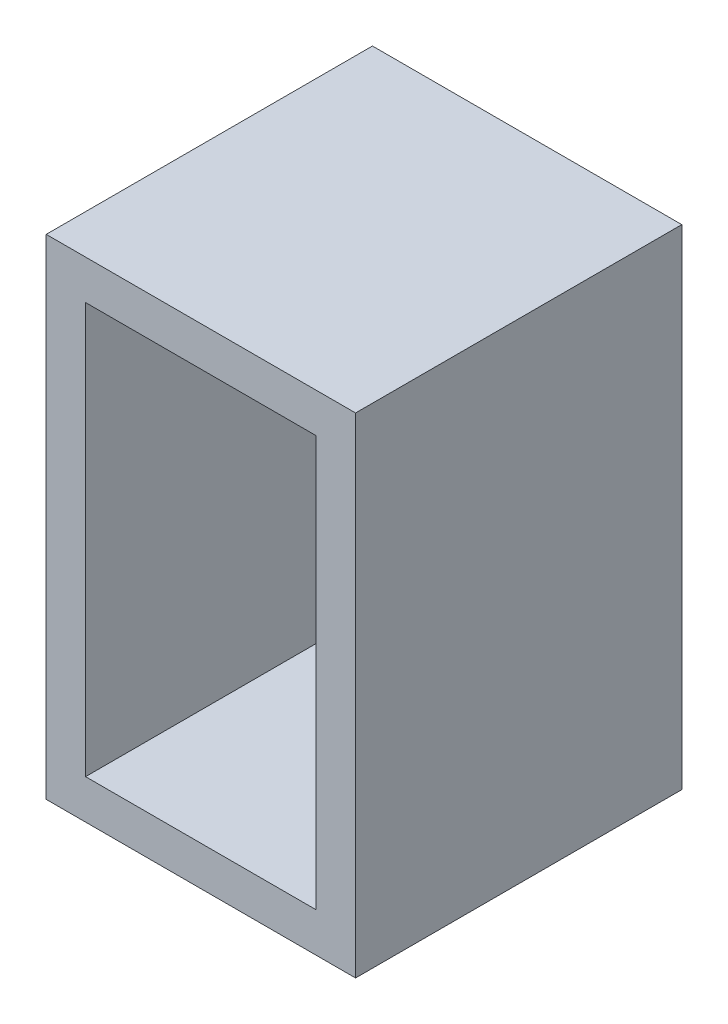
ISO-10303-21;
HEADER;
FILE_DESCRIPTION(('STEP AP214'),'2;1');
FILE_NAME('part.step','',(''),(''),'','','');
FILE_SCHEMA(('AUTOMOTIVE_DESIGN { 1 0 10303 214 1 1 1 1 }'));
ENDSEC;
DATA;
#1=APPLICATION_CONTEXT('core data for automotive mechanical design processes');
#2=APPLICATION_PROTOCOL_DEFINITION('international standard','automotive_design',2000,#1);
#3=PRODUCT_CONTEXT('',#1,'mechanical');
#4=PRODUCT('Part','Part','',(#3));
#5=PRODUCT_RELATED_PRODUCT_CATEGORY('part','',(#4));
#6=PRODUCT_DEFINITION_FORMATION('','',#4);
#7=PRODUCT_DEFINITION_CONTEXT('part definition',#1,'design');
#8=PRODUCT_DEFINITION('design','',#6,#7);
#9=PRODUCT_DEFINITION_SHAPE('','',#8);
#10=(LENGTH_UNIT() NAMED_UNIT(*) SI_UNIT(.MILLI.,.METRE.));
#11=(NAMED_UNIT(*) PLANE_ANGLE_UNIT() SI_UNIT($,.RADIAN.));
#12=(NAMED_UNIT(*) SI_UNIT($,.STERADIAN.) SOLID_ANGLE_UNIT());
#13=UNCERTAINTY_MEASURE_WITH_UNIT(LENGTH_MEASURE(1.E-05),#10,'distance_accuracy_value','');
#14=(GEOMETRIC_REPRESENTATION_CONTEXT(3) GLOBAL_UNCERTAINTY_ASSIGNED_CONTEXT((#13)) GLOBAL_UNIT_ASSIGNED_CONTEXT((#10,
#11,#12)) REPRESENTATION_CONTEXT('',''));
#15=CARTESIAN_POINT('',(0.,0.,0.));
#16=DIRECTION('',(0.,0.,1.));
#17=DIRECTION('',(1.,0.,0.));
#18=AXIS2_PLACEMENT_3D('',#15,#16,#17);
#19=CARTESIAN_POINT('',(0.,8.24999999999999,13.2544332206247));
#20=DIRECTION('',(0.,1.,0.));
#21=DIRECTION('',(0.,0.,1.));
#22=AXIS2_PLACEMENT_3D('',#19,#20,#21);
#23=PLANE('',#22);
#24=DIRECTION('',(0.,0.,1.));
#25=VECTOR('',#24,1.);
#26=CARTESIAN_POINT('',(1.25,8.24999999999999,-11.1241437954473));
#27=LINE('',#26,#25);
#28=CARTESIAN_POINT('',(1.25,8.24999999999999,-2.));
#29=VERTEX_POINT('',#28);
#30=CARTESIAN_POINT('',(1.25,8.24999999999999,0.));
#31=VERTEX_POINT('',#30);
#32=EDGE_CURVE('E178',#29,#31,#27,.T.);
#33=ORIENTED_EDGE('',*,*,#32,.F.);
#34=DIRECTION('',(1.,0.,0.));
#35=VECTOR('',#34,1.);
#36=CARTESIAN_POINT('',(0.,8.24999999999999,-2.));
#37=LINE('',#36,#35);
#38=CARTESIAN_POINT('',(-1.45,8.24999999999999,-2.));
#39=VERTEX_POINT('',#38);
#40=EDGE_CURVE('E70',#39,#29,#37,.T.);
#41=ORIENTED_EDGE('',*,*,#40,.F.);
#42=DIRECTION('',(0.,0.,-1.));
#43=VECTOR('',#42,1.);
#44=CARTESIAN_POINT('',(-1.45,8.24999999999999,13.2544332206247));
#45=LINE('',#44,#43);
#46=CARTESIAN_POINT('',(-1.45,8.24999999999999,0.));
#47=VERTEX_POINT('',#46);
#48=EDGE_CURVE('E184',#47,#39,#45,.T.);
#49=ORIENTED_EDGE('',*,*,#48,.F.);
#50=DIRECTION('',(1.,0.,0.));
#51=VECTOR('',#50,1.);
#52=CARTESIAN_POINT('',(0.,8.24999999999999,0.));
#53=LINE('',#52,#51);
#54=EDGE_CURVE('E171',#47,#31,#53,.T.);
#55=ORIENTED_EDGE('',*,*,#54,.T.);
#56=EDGE_LOOP('',(#33,#41,#49,#55));
#57=FACE_BOUND('',#56,.T.);
#58=ADVANCED_FACE('F47',(#57),#23,.T.);
#59=CARTESIAN_POINT('',(0.,0.,-2.));
#60=DIRECTION('',(0.,0.,1.));
#61=DIRECTION('',(1.,0.,0.));
#62=AXIS2_PLACEMENT_3D('',#59,#60,#61);
#63=PLANE('',#62);
#64=ORIENTED_EDGE('',*,*,#40,.T.);
#65=DIRECTION('',(0.,-1.,0.));
#66=VECTOR('',#65,1.);
#67=CARTESIAN_POINT('',(1.25,0.,-2.));
#68=LINE('',#67,#66);
#69=CARTESIAN_POINT('',(1.25,-15.25,-2.));
#70=VERTEX_POINT('',#69);
#71=EDGE_CURVE('E63',#29,#70,#68,.T.);
#72=ORIENTED_EDGE('',*,*,#71,.T.);
#73=DIRECTION('',(1.,0.,0.));
#74=VECTOR('',#73,1.);
#75=CARTESIAN_POINT('',(0.,-15.25,-2.));
#76=LINE('',#75,#74);
#77=CARTESIAN_POINT('',(10.25,-15.25,-2.));
#78=VERTEX_POINT('',#77);
#79=EDGE_CURVE('E224',#70,#78,#76,.T.);
#80=ORIENTED_EDGE('',*,*,#79,.T.);
#81=DIRECTION('',(0.,-1.,0.));
#82=VECTOR('',#81,1.);
#83=CARTESIAN_POINT('',(10.25,0.,-2.));
#84=LINE('',#83,#82);
#85=CARTESIAN_POINT('',(10.25,8.24999999999999,-2.));
#86=VERTEX_POINT('',#85);
#87=EDGE_CURVE('E176',#86,#78,#84,.T.);
#88=ORIENTED_EDGE('',*,*,#87,.F.);
#89=CARTESIAN_POINT('',(11.75,8.24999999999999,-2.));
#90=VERTEX_POINT('',#89);
#91=EDGE_CURVE('E216',#86,#90,#37,.T.);
#92=ORIENTED_EDGE('',*,*,#91,.T.);
#93=DIRECTION('',(0.,1.,0.));
#94=VECTOR('',#93,1.);
#95=CARTESIAN_POINT('',(11.75,0.,-2.));
#96=LINE('',#95,#94);
#97=CARTESIAN_POINT('',(11.75,9.44999999999999,-2.));
#98=VERTEX_POINT('',#97);
#99=EDGE_CURVE('E205',#90,#98,#96,.T.);
#100=ORIENTED_EDGE('',*,*,#99,.T.);
#101=DIRECTION('',(1.,0.,0.));
#102=VECTOR('',#101,1.);
#103=CARTESIAN_POINT('',(0.,9.44999999999999,-2.));
#104=LINE('',#103,#102);
#105=CARTESIAN_POINT('',(-1.45,9.44999999999999,-2.));
#106=VERTEX_POINT('',#105);
#107=EDGE_CURVE('E200',#106,#98,#104,.T.);
#108=ORIENTED_EDGE('',*,*,#107,.F.);
#109=DIRECTION('',(0.,-1.,0.));
#110=VECTOR('',#109,1.);
#111=CARTESIAN_POINT('',(-1.45,0.,-2.));
#112=LINE('',#111,#110);
#113=EDGE_CURVE('E213',#106,#39,#112,.T.);
#114=ORIENTED_EDGE('',*,*,#113,.T.);
#115=EDGE_LOOP('',(#64,#72,#80,#88,#92,#100,#108,#114));
#116=FACE_BOUND('',#115,.T.);
#117=DIRECTION('',(0.,-1.,0.));
#118=VECTOR('',#117,1.);
#119=CARTESIAN_POINT('',(13.75,21.75,-2.));
#120=LINE('',#119,#118);
#121=CARTESIAN_POINT('',(13.75,21.75,-2.));
#122=VERTEX_POINT('',#121);
#123=CARTESIAN_POINT('',(13.75,-21.75,-2.));
#124=VERTEX_POINT('',#123);
#125=EDGE_CURVE('E181',#122,#124,#120,.T.);
#126=ORIENTED_EDGE('',*,*,#125,.T.);
#127=DIRECTION('',(-1.,0.,0.));
#128=VECTOR('',#127,1.);
#129=CARTESIAN_POINT('',(-13.75,-21.75,-2.));
#130=LINE('',#129,#128);
#131=CARTESIAN_POINT('',(-13.75,-21.75,-2.));
#132=VERTEX_POINT('',#131);
#133=EDGE_CURVE('E342',#124,#132,#130,.T.);
#134=ORIENTED_EDGE('',*,*,#133,.T.);
#135=DIRECTION('',(0.,1.,0.));
#136=VECTOR('',#135,1.);
#137=CARTESIAN_POINT('',(-13.75,21.75,-2.));
#138=LINE('',#137,#136);
#139=CARTESIAN_POINT('',(-13.75,21.75,-2.));
#140=VERTEX_POINT('',#139);
#141=EDGE_CURVE('E338',#132,#140,#138,.T.);
#142=ORIENTED_EDGE('',*,*,#141,.T.);
#143=DIRECTION('',(1.,0.,0.));
#144=VECTOR('',#143,1.);
#145=CARTESIAN_POINT('',(-13.75,21.75,-2.));
#146=LINE('',#145,#144);
#147=EDGE_CURVE('E325',#140,#122,#146,.T.);
#148=ORIENTED_EDGE('',*,*,#147,.T.);
#149=EDGE_LOOP('',(#126,#134,#142,#148));
#150=FACE_BOUND('',#149,.T.);
#151=ADVANCED_FACE('F364',(#116,#150),#63,.F.);
#152=CARTESIAN_POINT('',(0.,0.,0.));
#153=DIRECTION('',(0.,0.,1.));
#154=DIRECTION('',(1.,0.,0.));
#155=AXIS2_PLACEMENT_3D('',#152,#153,#154);
#156=PLANE('',#155);
#157=DIRECTION('',(0.,-1.,0.));
#158=VECTOR('',#157,1.);
#159=CARTESIAN_POINT('',(1.25,0.,0.));
#160=LINE('',#159,#158);
#161=CARTESIAN_POINT('',(1.25,-15.25,0.));
#162=VERTEX_POINT('',#161);
#163=EDGE_CURVE('E167',#31,#162,#160,.T.);
#164=ORIENTED_EDGE('',*,*,#163,.F.);
#165=ORIENTED_EDGE('',*,*,#54,.F.);
#166=DIRECTION('',(0.,-1.,0.));
#167=VECTOR('',#166,1.);
#168=CARTESIAN_POINT('',(-1.45,0.,0.));
#169=LINE('',#168,#167);
#170=CARTESIAN_POINT('',(-1.45,9.44999999999999,0.));
#171=VERTEX_POINT('',#170);
#172=EDGE_CURVE('E195',#171,#47,#169,.T.);
#173=ORIENTED_EDGE('',*,*,#172,.F.);
#174=DIRECTION('',(1.,0.,0.));
#175=VECTOR('',#174,1.);
#176=CARTESIAN_POINT('',(0.,9.44999999999999,0.));
#177=LINE('',#176,#175);
#178=CARTESIAN_POINT('',(10.25,9.44999999999999,0.));
#179=VERTEX_POINT('',#178);
#180=EDGE_CURVE('E210',#171,#179,#177,.T.);
#181=ORIENTED_EDGE('',*,*,#180,.T.);
#182=DIRECTION('',(0.,1.,0.));
#183=VECTOR('',#182,1.);
#184=CARTESIAN_POINT('',(10.25,18.25,0.));
#185=LINE('',#184,#183);
#186=CARTESIAN_POINT('',(10.25,18.25,0.));
#187=VERTEX_POINT('',#186);
#188=EDGE_CURVE('E257',#179,#187,#185,.T.);
#189=ORIENTED_EDGE('',*,*,#188,.T.);
#190=DIRECTION('',(-1.,0.,0.));
#191=VECTOR('',#190,1.);
#192=CARTESIAN_POINT('',(10.25,18.25,0.));
#193=LINE('',#192,#191);
#194=CARTESIAN_POINT('',(-10.25,18.25,0.));
#195=VERTEX_POINT('',#194);
#196=EDGE_CURVE('E239',#187,#195,#193,.T.);
#197=ORIENTED_EDGE('',*,*,#196,.T.);
#198=DIRECTION('',(0.,-1.,0.));
#199=VECTOR('',#198,1.);
#200=CARTESIAN_POINT('',(-10.25,18.25,0.));
#201=LINE('',#200,#199);
#202=CARTESIAN_POINT('',(-10.25,-18.25,0.));
#203=VERTEX_POINT('',#202);
#204=EDGE_CURVE('E229',#195,#203,#201,.T.);
#205=ORIENTED_EDGE('',*,*,#204,.T.);
#206=DIRECTION('',(1.,0.,0.));
#207=VECTOR('',#206,1.);
#208=CARTESIAN_POINT('',(10.25,-18.25,0.));
#209=LINE('',#208,#207);
#210=CARTESIAN_POINT('',(10.25,-18.25,0.));
#211=VERTEX_POINT('',#210);
#212=EDGE_CURVE('E253',#203,#211,#209,.T.);
#213=ORIENTED_EDGE('',*,*,#212,.T.);
#214=CARTESIAN_POINT('',(10.25,-15.25,0.));
#215=VERTEX_POINT('',#214);
#216=EDGE_CURVE('E258',#211,#215,#185,.T.);
#217=ORIENTED_EDGE('',*,*,#216,.T.);
#218=DIRECTION('',(1.,0.,0.));
#219=VECTOR('',#218,1.);
#220=CARTESIAN_POINT('',(0.,-15.25,0.));
#221=LINE('',#220,#219);
#222=EDGE_CURVE('E174',#162,#215,#221,.T.);
#223=ORIENTED_EDGE('',*,*,#222,.F.);
#224=EDGE_LOOP('',(#164,#165,#173,#181,#189,#197,#205,#213,#217,#223));
#225=FACE_BOUND('',#224,.T.);
#226=ADVANCED_FACE('F168',(#225),#156,.T.);
#227=CARTESIAN_POINT('',(0.,0.,27.));
#228=DIRECTION('',(0.,0.,-1.));
#229=DIRECTION('',(-1.,0.,0.));
#230=AXIS2_PLACEMENT_3D('',#227,#228,#229);
#231=PLANE('',#230);
#232=DIRECTION('',(0.,-1.,0.));
#233=VECTOR('',#232,1.);
#234=CARTESIAN_POINT('',(-10.25,18.25,27.));
#235=LINE('',#234,#233);
#236=CARTESIAN_POINT('',(-10.25,18.25,27.));
#237=VERTEX_POINT('',#236);
#238=CARTESIAN_POINT('',(-10.25,-18.25,27.));
#239=VERTEX_POINT('',#238);
#240=EDGE_CURVE('E235',#237,#239,#235,.T.);
#241=ORIENTED_EDGE('',*,*,#240,.F.);
#242=DIRECTION('',(-1.,0.,0.));
#243=VECTOR('',#242,1.);
#244=CARTESIAN_POINT('',(10.25,18.25,27.));
#245=LINE('',#244,#243);
#246=CARTESIAN_POINT('',(10.25,18.25,27.));
#247=VERTEX_POINT('',#246);
#248=EDGE_CURVE('E246',#247,#237,#245,.T.);
#249=ORIENTED_EDGE('',*,*,#248,.F.);
#250=DIRECTION('',(0.,1.,0.));
#251=VECTOR('',#250,1.);
#252=CARTESIAN_POINT('',(10.25,18.25,27.));
#253=LINE('',#252,#251);
#254=CARTESIAN_POINT('',(10.25,-18.25,27.));
#255=VERTEX_POINT('',#254);
#256=EDGE_CURVE('E242',#255,#247,#253,.T.);
#257=ORIENTED_EDGE('',*,*,#256,.F.);
#258=DIRECTION('',(1.,0.,0.));
#259=VECTOR('',#258,1.);
#260=CARTESIAN_POINT('',(10.25,-18.25,27.));
#261=LINE('',#260,#259);
#262=EDGE_CURVE('E238',#239,#255,#261,.T.);
#263=ORIENTED_EDGE('',*,*,#262,.F.);
#264=EDGE_LOOP('',(#241,#249,#257,#263));
#265=FACE_BOUND('',#264,.T.);
#266=DIRECTION('',(0.,1.,0.));
#267=VECTOR('',#266,1.);
#268=CARTESIAN_POINT('',(13.75,21.75,27.));
#269=LINE('',#268,#267);
#270=CARTESIAN_POINT('',(13.75,-21.75,27.));
#271=VERTEX_POINT('',#270);
#272=CARTESIAN_POINT('',(13.75,21.75,27.));
#273=VERTEX_POINT('',#272);
#274=EDGE_CURVE('E349',#271,#273,#269,.T.);
#275=ORIENTED_EDGE('',*,*,#274,.T.);
#276=DIRECTION('',(-1.,0.,0.));
#277=VECTOR('',#276,1.);
#278=CARTESIAN_POINT('',(-13.75,21.75,27.));
#279=LINE('',#278,#277);
#280=CARTESIAN_POINT('',(-13.75,21.75,27.));
#281=VERTEX_POINT('',#280);
#282=EDGE_CURVE('E352',#273,#281,#279,.T.);
#283=ORIENTED_EDGE('',*,*,#282,.T.);
#284=DIRECTION('',(0.,-1.,0.));
#285=VECTOR('',#284,1.);
#286=CARTESIAN_POINT('',(-13.75,21.75,27.));
#287=LINE('',#286,#285);
#288=CARTESIAN_POINT('',(-13.75,-21.75,27.));
#289=VERTEX_POINT('',#288);
#290=EDGE_CURVE('E334',#281,#289,#287,.T.);
#291=ORIENTED_EDGE('',*,*,#290,.T.);
#292=DIRECTION('',(1.,0.,0.));
#293=VECTOR('',#292,1.);
#294=CARTESIAN_POINT('',(-13.75,-21.75,27.));
#295=LINE('',#294,#293);
#296=EDGE_CURVE('E217',#289,#271,#295,.T.);
#297=ORIENTED_EDGE('',*,*,#296,.T.);
#298=EDGE_LOOP('',(#275,#283,#291,#297));
#299=FACE_BOUND('',#298,.T.);
#300=ADVANCED_FACE('F49',(#265,#299),#231,.F.);
#301=CARTESIAN_POINT('',(-10.25,18.25,27.));
#302=DIRECTION('',(1.,0.,0.));
#303=DIRECTION('',(0.,1.,0.));
#304=AXIS2_PLACEMENT_3D('',#301,#302,#303);
#305=PLANE('',#304);
#306=ORIENTED_EDGE('',*,*,#204,.F.);
#307=DIRECTION('',(0.,0.,-1.));
#308=VECTOR('',#307,1.);
#309=CARTESIAN_POINT('',(-10.25,18.25,27.));
#310=LINE('',#309,#308);
#311=EDGE_CURVE('E249',#237,#195,#310,.T.);
#312=ORIENTED_EDGE('',*,*,#311,.F.);
#313=ORIENTED_EDGE('',*,*,#240,.T.);
#314=DIRECTION('',(0.,0.,-1.));
#315=VECTOR('',#314,1.);
#316=CARTESIAN_POINT('',(-10.25,-18.25,27.));
#317=LINE('',#316,#315);
#318=EDGE_CURVE('E11',#239,#203,#317,.T.);
#319=ORIENTED_EDGE('',*,*,#318,.T.);
#320=EDGE_LOOP('',(#306,#312,#313,#319));
#321=FACE_BOUND('',#320,.T.);
#322=ADVANCED_FACE('F285',(#321),#305,.T.);
#323=CARTESIAN_POINT('',(10.25,-18.25,27.));
#324=DIRECTION('',(0.,1.,0.));
#325=DIRECTION('',(0.,0.,1.));
#326=AXIS2_PLACEMENT_3D('',#323,#324,#325);
#327=PLANE('',#326);
#328=ORIENTED_EDGE('',*,*,#212,.F.);
#329=ORIENTED_EDGE('',*,*,#318,.F.);
#330=ORIENTED_EDGE('',*,*,#262,.T.);
#331=DIRECTION('',(0.,0.,-1.));
#332=VECTOR('',#331,1.);
#333=CARTESIAN_POINT('',(10.25,-18.25,27.));
#334=LINE('',#333,#332);
#335=EDGE_CURVE('E56',#255,#211,#334,.T.);
#336=ORIENTED_EDGE('',*,*,#335,.T.);
#337=EDGE_LOOP('',(#328,#329,#330,#336));
#338=FACE_BOUND('',#337,.T.);
#339=ADVANCED_FACE('F275',(#338),#327,.T.);
#340=CARTESIAN_POINT('',(10.25,18.25,27.));
#341=DIRECTION('',(-1.,0.,0.));
#342=DIRECTION('',(0.,-1.,0.));
#343=AXIS2_PLACEMENT_3D('',#340,#341,#342);
#344=PLANE('',#343);
#345=CARTESIAN_POINT('',(10.25,8.24999999999999,0.));
#346=VERTEX_POINT('',#345);
#347=EDGE_CURVE('E261',#346,#179,#185,.T.);
#348=ORIENTED_EDGE('',*,*,#347,.F.);
#349=DIRECTION('',(0.,0.,1.));
#350=VECTOR('',#349,1.);
#351=CARTESIAN_POINT('',(10.25,8.24999999999999,-11.1241437954473));
#352=LINE('',#351,#350);
#353=EDGE_CURVE('E182',#86,#346,#352,.T.);
#354=ORIENTED_EDGE('',*,*,#353,.F.);
#355=ORIENTED_EDGE('',*,*,#87,.T.);
#356=DIRECTION('',(0.,0.,-1.));
#357=VECTOR('',#356,1.);
#358=CARTESIAN_POINT('',(10.25,-15.25,23.7697286480094));
#359=LINE('',#358,#357);
#360=EDGE_CURVE('E223',#215,#78,#359,.T.);
#361=ORIENTED_EDGE('',*,*,#360,.F.);
#362=ORIENTED_EDGE('',*,*,#216,.F.);
#363=ORIENTED_EDGE('',*,*,#335,.F.);
#364=ORIENTED_EDGE('',*,*,#256,.T.);
#365=DIRECTION('',(0.,0.,-1.));
#366=VECTOR('',#365,1.);
#367=CARTESIAN_POINT('',(10.25,18.25,27.));
#368=LINE('',#367,#366);
#369=EDGE_CURVE('E268',#247,#187,#368,.T.);
#370=ORIENTED_EDGE('',*,*,#369,.T.);
#371=ORIENTED_EDGE('',*,*,#188,.F.);
#372=EDGE_LOOP('',(#348,#354,#355,#361,#362,#363,#364,#370,#371));
#373=FACE_BOUND('',#372,.T.);
#374=ADVANCED_FACE('F281',(#373),#344,.T.);
#375=CARTESIAN_POINT('',(10.25,18.25,27.));
#376=DIRECTION('',(0.,-1.,0.));
#377=DIRECTION('',(1.,0.,0.));
#378=AXIS2_PLACEMENT_3D('',#375,#376,#377);
#379=PLANE('',#378);
#380=ORIENTED_EDGE('',*,*,#196,.F.);
#381=ORIENTED_EDGE('',*,*,#369,.F.);
#382=ORIENTED_EDGE('',*,*,#248,.T.);
#383=ORIENTED_EDGE('',*,*,#311,.T.);
#384=EDGE_LOOP('',(#380,#381,#382,#383));
#385=FACE_BOUND('',#384,.T.);
#386=ADVANCED_FACE('F288',(#385),#379,.T.);
#387=CARTESIAN_POINT('',(0.,-15.25,23.7697286480094));
#388=DIRECTION('',(0.,1.,0.));
#389=DIRECTION('',(0.,0.,1.));
#390=AXIS2_PLACEMENT_3D('',#387,#388,#389);
#391=PLANE('',#390);
#392=ORIENTED_EDGE('',*,*,#222,.T.);
#393=ORIENTED_EDGE('',*,*,#360,.T.);
#394=ORIENTED_EDGE('',*,*,#79,.F.);
#395=DIRECTION('',(0.,0.,-1.));
#396=VECTOR('',#395,1.);
#397=CARTESIAN_POINT('',(1.25,-15.25,23.7697286480094));
#398=LINE('',#397,#396);
#399=EDGE_CURVE('E193',#162,#70,#398,.T.);
#400=ORIENTED_EDGE('',*,*,#399,.F.);
#401=EDGE_LOOP('',(#392,#393,#394,#400));
#402=FACE_BOUND('',#401,.T.);
#403=ADVANCED_FACE('F367',(#402),#391,.T.);
#404=CARTESIAN_POINT('',(1.25,0.,23.7697286480094));
#405=DIRECTION('',(1.,0.,0.));
#406=DIRECTION('',(0.,1.,0.));
#407=AXIS2_PLACEMENT_3D('',#404,#405,#406);
#408=PLANE('',#407);
#409=ORIENTED_EDGE('',*,*,#163,.T.);
#410=ORIENTED_EDGE('',*,*,#399,.T.);
#411=ORIENTED_EDGE('',*,*,#71,.F.);
#412=ORIENTED_EDGE('',*,*,#32,.T.);
#413=EDGE_LOOP('',(#409,#410,#411,#412));
#414=FACE_BOUND('',#413,.T.);
#415=ADVANCED_FACE('F179',(#414),#408,.T.);
#416=ORIENTED_EDGE('',*,*,#353,.T.);
#417=CARTESIAN_POINT('',(11.75,8.24999999999999,0.));
#418=VERTEX_POINT('',#417);
#419=EDGE_CURVE('E188',#346,#418,#53,.T.);
#420=ORIENTED_EDGE('',*,*,#419,.T.);
#421=DIRECTION('',(0.,0.,-1.));
#422=VECTOR('',#421,1.);
#423=CARTESIAN_POINT('',(11.75,8.24999999999999,13.2544332206247));
#424=LINE('',#423,#422);
#425=EDGE_CURVE('E201',#418,#90,#424,.T.);
#426=ORIENTED_EDGE('',*,*,#425,.T.);
#427=ORIENTED_EDGE('',*,*,#91,.F.);
#428=EDGE_LOOP('',(#416,#420,#426,#427));
#429=FACE_BOUND('',#428,.T.);
#430=ADVANCED_FACE('F362',(#429),#23,.T.);
#431=CARTESIAN_POINT('',(11.75,0.,13.2544332206247));
#432=DIRECTION('',(-1.,0.,0.));
#433=DIRECTION('',(0.,-1.,0.));
#434=AXIS2_PLACEMENT_3D('',#431,#432,#433);
#435=PLANE('',#434);
#436=DIRECTION('',(0.,1.,0.));
#437=VECTOR('',#436,1.);
#438=CARTESIAN_POINT('',(11.75,0.,0.));
#439=LINE('',#438,#437);
#440=CARTESIAN_POINT('',(11.75,9.44999999999999,0.));
#441=VERTEX_POINT('',#440);
#442=EDGE_CURVE('E187',#418,#441,#439,.T.);
#443=ORIENTED_EDGE('',*,*,#442,.T.);
#444=DIRECTION('',(0.,0.,-1.));
#445=VECTOR('',#444,1.);
#446=CARTESIAN_POINT('',(11.75,9.44999999999999,13.2544332206247));
#447=LINE('',#446,#445);
#448=EDGE_CURVE('E206',#441,#98,#447,.T.);
#449=ORIENTED_EDGE('',*,*,#448,.T.);
#450=ORIENTED_EDGE('',*,*,#99,.F.);
#451=ORIENTED_EDGE('',*,*,#425,.F.);
#452=EDGE_LOOP('',(#443,#449,#450,#451));
#453=FACE_BOUND('',#452,.T.);
#454=ADVANCED_FACE('F387',(#453),#435,.T.);
#455=CARTESIAN_POINT('',(0.,9.44999999999999,13.2544332206247));
#456=DIRECTION('',(0.,1.,0.));
#457=DIRECTION('',(0.,0.,1.));
#458=AXIS2_PLACEMENT_3D('',#455,#456,#457);
#459=PLANE('',#458);
#460=DIRECTION('',(0.,0.,-1.));
#461=VECTOR('',#460,1.);
#462=CARTESIAN_POINT('',(-1.45,9.44999999999999,13.2544332206247));
#463=LINE('',#462,#461);
#464=EDGE_CURVE('E209',#171,#106,#463,.T.);
#465=ORIENTED_EDGE('',*,*,#464,.T.);
#466=ORIENTED_EDGE('',*,*,#107,.T.);
#467=ORIENTED_EDGE('',*,*,#448,.F.);
#468=EDGE_CURVE('E302',#179,#441,#177,.T.);
#469=ORIENTED_EDGE('',*,*,#468,.F.);
#470=ORIENTED_EDGE('',*,*,#180,.F.);
#471=EDGE_LOOP('',(#465,#466,#467,#469,#470));
#472=FACE_BOUND('',#471,.T.);
#473=ADVANCED_FACE('F305',(#472),#459,.F.);
#474=CARTESIAN_POINT('',(-1.45,0.,13.2544332206247));
#475=DIRECTION('',(1.,0.,0.));
#476=DIRECTION('',(0.,0.,-1.));
#477=AXIS2_PLACEMENT_3D('',#474,#475,#476);
#478=PLANE('',#477);
#479=ORIENTED_EDGE('',*,*,#172,.T.);
#480=ORIENTED_EDGE('',*,*,#48,.T.);
#481=ORIENTED_EDGE('',*,*,#113,.F.);
#482=ORIENTED_EDGE('',*,*,#464,.F.);
#483=EDGE_LOOP('',(#479,#480,#481,#482));
#484=FACE_BOUND('',#483,.T.);
#485=ADVANCED_FACE('F395',(#484),#478,.T.);
#486=CARTESIAN_POINT('',(0.,0.,0.));
#487=DIRECTION('',(0.,0.,1.));
#488=DIRECTION('',(1.,0.,0.));
#489=AXIS2_PLACEMENT_3D('',#486,#487,#488);
#490=PLANE('',#489);
#491=ORIENTED_EDGE('',*,*,#347,.T.);
#492=ORIENTED_EDGE('',*,*,#468,.T.);
#493=ORIENTED_EDGE('',*,*,#442,.F.);
#494=ORIENTED_EDGE('',*,*,#419,.F.);
#495=EDGE_LOOP('',(#491,#492,#493,#494));
#496=FACE_BOUND('',#495,.T.);
#497=ADVANCED_FACE('F300',(#496),#490,.F.);
#498=CARTESIAN_POINT('',(-13.75,-21.75,78.4635793547242));
#499=DIRECTION('',(0.,-1.,0.));
#500=DIRECTION('',(0.,0.,-1.));
#501=AXIS2_PLACEMENT_3D('',#498,#499,#500);
#502=PLANE('',#501);
#503=ORIENTED_EDGE('',*,*,#296,.F.);
#504=DIRECTION('',(0.,0.,-1.));
#505=VECTOR('',#504,1.);
#506=CARTESIAN_POINT('',(-13.75,-21.75,78.4635793547242));
#507=LINE('',#506,#505);
#508=EDGE_CURVE('E324',#289,#132,#507,.T.);
#509=ORIENTED_EDGE('',*,*,#508,.T.);
#510=ORIENTED_EDGE('',*,*,#133,.F.);
#511=DIRECTION('',(0.,0.,-1.));
#512=VECTOR('',#511,1.);
#513=CARTESIAN_POINT('',(13.75,-21.75,78.4635793547242));
#514=LINE('',#513,#512);
#515=EDGE_CURVE('E321',#271,#124,#514,.T.);
#516=ORIENTED_EDGE('',*,*,#515,.F.);
#517=EDGE_LOOP('',(#503,#509,#510,#516));
#518=FACE_BOUND('',#517,.T.);
#519=ADVANCED_FACE('F405',(#518),#502,.T.);
#520=CARTESIAN_POINT('',(-13.75,21.75,78.4635793547242));
#521=DIRECTION('',(-1.,0.,0.));
#522=DIRECTION('',(0.,0.,1.));
#523=AXIS2_PLACEMENT_3D('',#520,#521,#522);
#524=PLANE('',#523);
#525=ORIENTED_EDGE('',*,*,#290,.F.);
#526=DIRECTION('',(0.,0.,-1.));
#527=VECTOR('',#526,1.);
#528=CARTESIAN_POINT('',(-13.75,21.75,78.4635793547242));
#529=LINE('',#528,#527);
#530=EDGE_CURVE('E328',#281,#140,#529,.T.);
#531=ORIENTED_EDGE('',*,*,#530,.T.);
#532=ORIENTED_EDGE('',*,*,#141,.F.);
#533=ORIENTED_EDGE('',*,*,#508,.F.);
#534=EDGE_LOOP('',(#525,#531,#532,#533));
#535=FACE_BOUND('',#534,.T.);
#536=ADVANCED_FACE('F408',(#535),#524,.T.);
#537=CARTESIAN_POINT('',(-13.75,21.75,78.4635793547242));
#538=DIRECTION('',(0.,1.,0.));
#539=DIRECTION('',(0.,0.,1.));
#540=AXIS2_PLACEMENT_3D('',#537,#538,#539);
#541=PLANE('',#540);
#542=ORIENTED_EDGE('',*,*,#282,.F.);
#543=DIRECTION('',(0.,0.,-1.));
#544=VECTOR('',#543,1.);
#545=CARTESIAN_POINT('',(13.75,21.75,78.4635793547242));
#546=LINE('',#545,#544);
#547=EDGE_CURVE('E331',#273,#122,#546,.T.);
#548=ORIENTED_EDGE('',*,*,#547,.T.);
#549=ORIENTED_EDGE('',*,*,#147,.F.);
#550=ORIENTED_EDGE('',*,*,#530,.F.);
#551=EDGE_LOOP('',(#542,#548,#549,#550));
#552=FACE_BOUND('',#551,.T.);
#553=ADVANCED_FACE('F403',(#552),#541,.T.);
#554=CARTESIAN_POINT('',(13.75,21.75,78.4635793547242));
#555=DIRECTION('',(1.,0.,0.));
#556=DIRECTION('',(0.,0.,-1.));
#557=AXIS2_PLACEMENT_3D('',#554,#555,#556);
#558=PLANE('',#557);
#559=ORIENTED_EDGE('',*,*,#274,.F.);
#560=ORIENTED_EDGE('',*,*,#515,.T.);
#561=ORIENTED_EDGE('',*,*,#125,.F.);
#562=ORIENTED_EDGE('',*,*,#547,.F.);
#563=EDGE_LOOP('',(#559,#560,#561,#562));
#564=FACE_BOUND('',#563,.T.);
#565=ADVANCED_FACE('F401',(#564),#558,.T.);
#566=CLOSED_SHELL('',(#58,#151,#226,#300,#322,#339,#374,#386,#403,#415,#430,#454,#473,#485,#497,
#519,#536,#553,#565));
#567=MANIFOLD_SOLID_BREP('B2',#566);
#568=ADVANCED_BREP_SHAPE_REPRESENTATION('',(#18,#567),#14);
#569=SHAPE_DEFINITION_REPRESENTATION(#9,#568);
ENDSEC;
END-ISO-10303-21;
